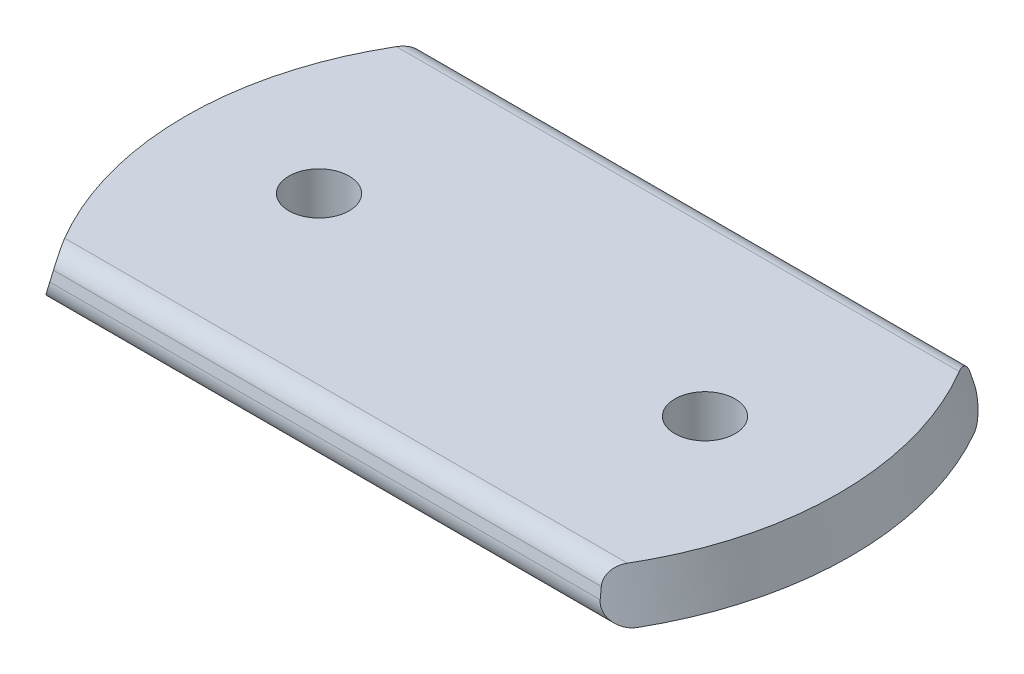
ISO-10303-21;
HEADER;
FILE_DESCRIPTION(('STEP AP214'),'2;1');
FILE_NAME('part.step','',(''),(''),'','','');
FILE_SCHEMA(('AUTOMOTIVE_DESIGN { 1 0 10303 214 1 1 1 1 }'));
ENDSEC;
DATA;
#1=APPLICATION_CONTEXT('core data for automotive mechanical design processes');
#2=APPLICATION_PROTOCOL_DEFINITION('international standard','automotive_design',2000,#1);
#3=PRODUCT_CONTEXT('',#1,'mechanical');
#4=PRODUCT('Part','Part','',(#3));
#5=PRODUCT_RELATED_PRODUCT_CATEGORY('part','',(#4));
#6=PRODUCT_DEFINITION_FORMATION('','',#4);
#7=PRODUCT_DEFINITION_CONTEXT('part definition',#1,'design');
#8=PRODUCT_DEFINITION('design','',#6,#7);
#9=PRODUCT_DEFINITION_SHAPE('','',#8);
#10=(LENGTH_UNIT() NAMED_UNIT(*) SI_UNIT(.MILLI.,.METRE.));
#11=(NAMED_UNIT(*) PLANE_ANGLE_UNIT() SI_UNIT($,.RADIAN.));
#12=(NAMED_UNIT(*) SI_UNIT($,.STERADIAN.) SOLID_ANGLE_UNIT());
#13=UNCERTAINTY_MEASURE_WITH_UNIT(LENGTH_MEASURE(1.E-05),#10,'distance_accuracy_value','');
#14=(GEOMETRIC_REPRESENTATION_CONTEXT(3) GLOBAL_UNCERTAINTY_ASSIGNED_CONTEXT((#13)) GLOBAL_UNIT_ASSIGNED_CONTEXT((#10,
#11,#12)) REPRESENTATION_CONTEXT('',''));
#15=CARTESIAN_POINT('',(0.,0.,0.));
#16=DIRECTION('',(0.,0.,1.));
#17=DIRECTION('',(1.,0.,0.));
#18=AXIS2_PLACEMENT_3D('',#15,#16,#17);
#19=CARTESIAN_POINT('',(0.,0.,0.));
#20=DIRECTION('',(0.,-1.,0.));
#21=DIRECTION('',(0.,0.,1.));
#22=AXIS2_PLACEMENT_3D('',#19,#20,#21);
#23=CONICAL_SURFACE('',#22,4.4577,0.244346095279206);
#24=CARTESIAN_POINT('',(-3.57942120669858,0.635,-2.38167671819458));
#25=CARTESIAN_POINT('',(-3.59355382997378,0.529186447528919,-2.40805899990594));
#26=CARTESIAN_POINT('',(-3.60760688365874,0.423363004117447,-2.43444374770571));
#27=CARTESIAN_POINT('',(-3.63555385157925,0.2116963374504,-2.48721817497428));
#28=CARTESIAN_POINT('',(-3.64944776581787,0.105853114195205,-2.51360785444298));
#29=CARTESIAN_POINT('',(-3.6632621104693,0.,-2.54));
#30=B_SPLINE_CURVE_WITH_KNOTS('',3,(#24,#25,#26,#27,#28,#29),.UNSPECIFIED.,.F.,.F.,(4,2,4),(0.,
0.329894224999645,0.659788443650745),.UNSPECIFIED.);
#31=CARTESIAN_POINT('',(-3.60505037779976,0.442448161481963,-2.42968528353607));
#32=VERTEX_POINT('',#31);
#33=CARTESIAN_POINT('',(-3.62185516682838,0.315448161482057,-2.46134993989713));
#34=VERTEX_POINT('',#33);
#35=EDGE_CURVE('E102',#32,#34,#30,.T.);
#36=ORIENTED_EDGE('',*,*,#35,.T.);
#37=CARTESIAN_POINT('',(-3.62185516683046,0.315448161482316,-2.46134993989706));
#38=CARTESIAN_POINT('',(-3.62353183555817,0.302651367923082,-2.46455565149963));
#39=CARTESIAN_POINT('',(-3.62596736509378,0.289732996863643,-2.46670406697731));
#40=CARTESIAN_POINT('',(-3.63212169580509,0.264120625230632,-2.46901194904047));
#41=CARTESIAN_POINT('',(-3.63583086564031,0.251425671681207,-2.4691860188125));
#42=CARTESIAN_POINT('',(-3.64431462813736,0.226569815434635,-2.46771676040685));
#43=CARTESIAN_POINT('',(-3.6490855370032,0.214407236135877,-2.46607964014288));
#44=CARTESIAN_POINT('',(-3.65948446229193,0.190774125252389,-2.4611960184554));
#45=CARTESIAN_POINT('',(-3.66511413063485,0.179304988263944,-2.45794638744581));
#46=CARTESIAN_POINT('',(-3.6777648912269,0.15585960563507,-2.44953988490581));
#47=CARTESIAN_POINT('',(-3.68487195711251,0.143997287642441,-2.44419626560958));
#48=CARTESIAN_POINT('',(-3.6996643186097,0.121499181519146,-2.43197443052928));
#49=CARTESIAN_POINT('',(-3.70734968688322,0.110863547944283,-2.42509602168947));
#50=CARTESIAN_POINT('',(-3.72471633896126,0.0888558797669503,-2.40846785233722));
#51=CARTESIAN_POINT('',(-3.73448438987867,0.077778015823586,-2.39841855750968));
#52=CARTESIAN_POINT('',(-3.75429857399305,0.0576341523944457,-2.37668588915596));
#53=CARTESIAN_POINT('',(-3.76434505746357,0.0485708296904886,-2.36500037472346));
#54=CARTESIAN_POINT('',(-3.78589696620758,0.0314605923886662,-2.33848860628803));
#55=CARTESIAN_POINT('',(-3.79740627131619,0.0237425912771575,-2.32345208762564));
#56=CARTESIAN_POINT('',(-3.8200910211819,0.0113840272561639,-2.29195751893285));
#57=CARTESIAN_POINT('',(-3.8312670693501,0.00673753329528968,-2.27550227834519));
#58=CARTESIAN_POINT('',(-3.84663573867286,0.00253654005526298,-2.25142549938294));
#59=CARTESIAN_POINT('',(-3.85112029301407,0.00159170639421385,-2.24421395374768));
#60=CARTESIAN_POINT('',(-3.85993424148771,0.000324050276130284,-2.2296522088358));
#61=CARTESIAN_POINT('',(-3.86426377245061,6.65320806708225E-07,-2.22230214103325));
#62=CARTESIAN_POINT('',(-3.86850490529811,-7.97743175265648E-13,-2.21489482542318));
#63=B_SPLINE_CURVE_WITH_KNOTS('',3,(#37,#38,#39,#40,#41,#42,#43,#44,#45,#46,#47,#48,#49,#50,#51,
#52,#53,#54,#55,#56,#57,#58,#59,#60,#61,#62),.UNSPECIFIED.,.F.,.F.,(4,2,2,2,2,2,2,2,2,2,2,2,4),
(0.,0.0397721462028032,0.0792499254443225,0.11859281134565,0.15801235495698,0.202327667248636,
0.246648556951861,0.300032821014683,0.353487599872156,0.414560178265387,0.475514478887914,
0.501127194631331,0.526716716332967),.UNSPECIFIED.);
#64=CARTESIAN_POINT('',(-3.86850490529799,0.,-2.21489482542296));
#65=VERTEX_POINT('',#64);
#66=EDGE_CURVE('E109',#34,#65,#63,.T.);
#67=ORIENTED_EDGE('',*,*,#66,.T.);
#68=CARTESIAN_POINT('',(0.,0.,0.));
#69=DIRECTION('',(0.,1.,0.));
#70=DIRECTION('',(0.,0.,1.));
#71=AXIS2_PLACEMENT_3D('',#68,#69,#70);
#72=CIRCLE('',#71,4.4577);
#73=CARTESIAN_POINT('',(-3.86850490529799,0.,2.21489482542296));
#74=VERTEX_POINT('',#73);
#75=EDGE_CURVE('E223',#65,#74,#72,.T.);
#76=ORIENTED_EDGE('',*,*,#75,.T.);
#77=CARTESIAN_POINT('',(-3.86850490529799,0.,2.21489482542296));
#78=CARTESIAN_POINT('',(-3.85769754129733,1.28477227135762E-05,2.2337771917824));
#79=CARTESIAN_POINT('',(-3.8463212568722,0.00210204438034466,2.25226551973211));
#80=CARTESIAN_POINT('',(-3.82292552324251,0.0100331100659966,2.28789645867039));
#81=CARTESIAN_POINT('',(-3.81090862680471,0.0158609759308289,2.30504382446524));
#82=CARTESIAN_POINT('',(-3.7878310893495,0.0301378327912242,2.33598501007526));
#83=CARTESIAN_POINT('',(-3.77679246180608,0.0382731334020444,2.34994279156732));
#84=CARTESIAN_POINT('',(-3.75480387416784,0.0570945568251208,2.37615510651605));
#85=CARTESIAN_POINT('',(-3.74385408130791,0.0677846811122707,2.38840691988885));
#86=CARTESIAN_POINT('',(-3.72168006276897,0.0923387298476903,2.41158146978629));
#87=CARTESIAN_POINT('',(-3.71048637865391,0.106366981444188,2.42236072082367));
#88=CARTESIAN_POINT('',(-3.68911678426731,0.13691678113401,2.44100627920766));
#89=CARTESIAN_POINT('',(-3.67893901515319,0.153433631404841,2.44887798060821));
#90=CARTESIAN_POINT('',(-3.66322334561491,0.183015530298263,2.4591051076478));
#91=CARTESIAN_POINT('',(-3.65723742920078,0.195514772884092,2.46241819315957));
#92=CARTESIAN_POINT('',(-3.64631398490201,0.22128384488999,2.46711770477328));
#93=CARTESIAN_POINT('',(-3.64137334014695,0.23455122868328,2.4685099292117));
#94=CARTESIAN_POINT('',(-3.63358467907638,0.25910702475796,2.46908330827662));
#95=CARTESIAN_POINT('',(-3.63051962766198,0.270317761821268,2.46861978942549));
#96=CARTESIAN_POINT('',(-3.62539005997241,0.292867433194884,2.46616353826032));
#97=CARTESIAN_POINT('',(-3.6233315630543,0.304206733584755,2.46416178575149));
#98=CARTESIAN_POINT('',(-3.62185516682843,0.315448161481667,2.46134993989722));
#99=B_SPLINE_CURVE_WITH_KNOTS('',3,(#77,#78,#79,#80,#81,#82,#83,#84,#85,#86,#87,#88,#89,#90,#91,
#92,#93,#94,#95,#96,#97,#98),.UNSPECIFIED.,.F.,.F.,(4,2,2,2,2,2,2,2,2,2,4),(0.,
0.0650808976333647,0.129919447165532,0.188389191585578,0.246951121031619,0.309425631457381,
0.371783650699652,0.414371820555602,0.456831149837567,0.491587088924296,0.526548406712284),.UNSPECIFIED.);
#100=CARTESIAN_POINT('',(-3.62185516682838,0.315448161482057,2.46134993989713));
#101=VERTEX_POINT('',#100);
#102=EDGE_CURVE('E110',#74,#101,#99,.T.);
#103=ORIENTED_EDGE('',*,*,#102,.T.);
#104=CARTESIAN_POINT('',(-3.57942120669858,0.635,2.38167671819458));
#105=CARTESIAN_POINT('',(-3.59355382997378,0.529186447528919,2.40805899990594));
#106=CARTESIAN_POINT('',(-3.60760688365874,0.423363004117447,2.43444374770571));
#107=CARTESIAN_POINT('',(-3.63555385157925,0.2116963374504,2.48721817497428));
#108=CARTESIAN_POINT('',(-3.64944776581787,0.105853114195205,2.51360785444298));
#109=CARTESIAN_POINT('',(-3.6632621104693,0.,2.54));
#110=B_SPLINE_CURVE_WITH_KNOTS('',3,(#104,#105,#106,#107,#108,#109),.UNSPECIFIED.,.F.,.F.,(4,2,
4),(0.,0.329894224999645,0.659788443650745),.UNSPECIFIED.);
#111=CARTESIAN_POINT('',(-3.60505037779977,0.442448161481929,2.42968528353607));
#112=VERTEX_POINT('',#111);
#113=EDGE_CURVE('E126',#112,#101,#110,.T.);
#114=ORIENTED_EDGE('',*,*,#113,.F.);
#115=CARTESIAN_POINT('',(-3.60505037780288,0.442448161482316,2.42968528353598));
#116=CARTESIAN_POINT('',(-3.60351683648761,0.453903731813594,2.42684791105927));
#117=CARTESIAN_POINT('',(-3.60259930080507,0.465224667819872,2.42315969733341));
#118=CARTESIAN_POINT('',(-3.60197543178231,0.487229429827425,2.41424783379584));
#119=CARTESIAN_POINT('',(-3.60226435348951,0.497915584409928,2.40903027404083));
#120=CARTESIAN_POINT('',(-3.60402112924876,0.518380677834707,2.39719978949328));
#121=CARTESIAN_POINT('',(-3.6054892869793,0.528159382265468,2.39058650559539));
#122=CARTESIAN_POINT('',(-3.60949137315661,0.546577151586215,2.37619852638241));
#123=CARTESIAN_POINT('',(-3.61202586159684,0.555215614531771,2.36842322220699));
#124=CARTESIAN_POINT('',(-3.61809855392584,0.571433056633792,2.35172548288871));
#125=CARTESIAN_POINT('',(-3.62166350470801,0.578974462627466,2.34277650675638));
#126=CARTESIAN_POINT('',(-3.62959078672059,0.592624696894625,2.32417098366835));
#127=CARTESIAN_POINT('',(-3.63395349668359,0.598732841575587,2.3145141019478));
#128=CARTESIAN_POINT('',(-3.64399610679775,0.610287900439548,2.29327408517538));
#129=CARTESIAN_POINT('',(-3.64977530427532,0.615508993497572,2.28161522812382));
#130=CARTESIAN_POINT('',(-3.66195161447901,0.624088831060702,2.25794715600665));
#131=CARTESIAN_POINT('',(-3.66834906918393,0.627446537861267,2.24593774963334));
#132=CARTESIAN_POINT('',(-3.68421437006381,0.633328208008464,2.21701722438262));
#133=CARTESIAN_POINT('',(-3.69389683874262,0.634998922643189,2.2000437412127));
#134=CARTESIAN_POINT('',(-3.70380158672838,0.635000000000007,2.18323016906187));
#135=B_SPLINE_CURVE_WITH_KNOTS('',3,(#115,#116,#117,#118,#119,#120,#121,#122,#123,#124,#125,
#126,#127,#128,#129,#130,#131,#132,#133,#134),.UNSPECIFIED.,.F.,.F.,(4,2,2,2,2,2,2,2,2,4),(0.,
0.0356496979092752,0.0711593191952307,0.106678087900932,0.14221553294611,0.178774057747515,
0.215349983818304,0.257252222234309,0.299177772307115,0.357664321652882),.UNSPECIFIED.);
#136=CARTESIAN_POINT('',(-3.70380158672838,0.635,2.18323016906187));
#137=VERTEX_POINT('',#136);
#138=EDGE_CURVE('E128',#112,#137,#135,.T.);
#139=ORIENTED_EDGE('',*,*,#138,.T.);
#140=CARTESIAN_POINT('',(0.,0.635,0.));
#141=DIRECTION('',(0.,1.,0.));
#142=DIRECTION('',(0.,0.,1.));
#143=AXIS2_PLACEMENT_3D('',#140,#141,#142);
#144=CIRCLE('',#143,4.29937671819458);
#145=CARTESIAN_POINT('',(-3.70380158672838,0.635,-2.18323016906187));
#146=VERTEX_POINT('',#145);
#147=EDGE_CURVE('E104',#146,#137,#144,.T.);
#148=ORIENTED_EDGE('',*,*,#147,.F.);
#149=CARTESIAN_POINT('',(-3.70380158672838,0.635,-2.18323016906187));
#150=CARTESIAN_POINT('',(-3.69501254105115,0.635003156654622,-2.1981481730324));
#151=CARTESIAN_POINT('',(-3.68638838666827,0.633684342955495,-2.21321156760848));
#152=CARTESIAN_POINT('',(-3.66974011331162,0.628271785468378,-2.24329252460308));
#153=CARTESIAN_POINT('',(-3.6617201556718,0.624160460985696,-2.25830918746991));
#154=CARTESIAN_POINT('',(-3.6478445121476,0.613897197544928,-2.28546205520625));
#155=CARTESIAN_POINT('',(-3.6418463794629,0.608163705677054,-2.29768213449366));
#156=CARTESIAN_POINT('',(-3.63082103433196,0.594599089578594,-2.32134930340013));
#157=CARTESIAN_POINT('',(-3.62579173880106,0.586772554165542,-2.33279801624068));
#158=CARTESIAN_POINT('',(-3.61694115982392,0.568973879345322,-2.35464169625366));
#159=CARTESIAN_POINT('',(-3.61313153364109,0.558982481536817,-2.3650258852967));
#160=CARTESIAN_POINT('',(-3.60709863833828,0.537100081085371,-2.38412602870431));
#161=CARTESIAN_POINT('',(-3.6048736818196,0.525211115591873,-2.39284375030696));
#162=CARTESIAN_POINT('',(-3.60244018219319,0.501756542546049,-2.40704569837035));
#163=CARTESIAN_POINT('',(-3.60198904775445,0.490387238416409,-2.41281390748986));
#164=CARTESIAN_POINT('',(-3.60246617381185,0.466884133166213,-2.42261671418551));
#165=CARTESIAN_POINT('',(-3.60340153323925,0.454746704343675,-2.42664225259117));
#166=CARTESIAN_POINT('',(-3.60505037779968,0.442448161482579,-2.42968528353591));
#167=B_SPLINE_CURVE_WITH_KNOTS('',3,(#149,#150,#151,#152,#153,#154,#155,#156,#157,#158,#159,
#160,#161,#162,#163,#164,#165,#166),.UNSPECIFIED.,.F.,.F.,(4,2,2,2,2,2,2,2,4),(0.,
0.051960016866817,0.104250225994487,0.14838224931397,0.192418299119125,0.236863470297449,
0.281261244022129,0.319318422377635,0.357571130007116),.UNSPECIFIED.);
#168=EDGE_CURVE('E100',#146,#32,#167,.T.);
#169=ORIENTED_EDGE('',*,*,#168,.T.);
#170=EDGE_LOOP('',(#36,#67,#76,#103,#114,#139,#148,#169));
#171=FACE_BOUND('',#170,.T.);
#172=ADVANCED_FACE('F33',(#171),#23,.T.);
#173=CARTESIAN_POINT('',(-3.6632621104693,0.,2.54));
#174=DIRECTION('',(0.,0.241921895599668,0.970295726275996));
#175=DIRECTION('',(0.,-0.970295726275996,0.241921895599668));
#176=AXIS2_PLACEMENT_3D('',#173,#174,#175);
#177=PLANE('',#176);
#178=ORIENTED_EDGE('',*,*,#113,.T.);
#179=DIRECTION('',(1.,0.,0.));
#180=VECTOR('',#179,1.);
#181=CARTESIAN_POINT('',(-3.6632621104693,0.315448161482316,2.46134993989706));
#182=LINE('',#181,#180);
#183=CARTESIAN_POINT('',(3.62185516682838,0.315448161482057,2.46134993989713));
#184=VERTEX_POINT('',#183);
#185=EDGE_CURVE('E11',#101,#184,#182,.T.);
#186=ORIENTED_EDGE('',*,*,#185,.T.);
#187=CARTESIAN_POINT('',(3.57942120669858,0.635,2.38167671819458));
#188=CARTESIAN_POINT('',(3.59355382997378,0.529186447528919,2.40805899990594));
#189=CARTESIAN_POINT('',(3.60760688365874,0.423363004117447,2.43444374770571));
#190=CARTESIAN_POINT('',(3.63555385157925,0.2116963374504,2.48721817497428));
#191=CARTESIAN_POINT('',(3.64944776581787,0.105853114195205,2.51360785444298));
#192=CARTESIAN_POINT('',(3.6632621104693,0.,2.54));
#193=B_SPLINE_CURVE_WITH_KNOTS('',3,(#187,#188,#189,#190,#191,#192),.UNSPECIFIED.,.F.,.F.,(4,2,
4),(0.,0.329894224999645,0.659788443650745),.UNSPECIFIED.);
#194=CARTESIAN_POINT('',(3.60505037779976,0.442448161481965,2.42968528353607));
#195=VERTEX_POINT('',#194);
#196=EDGE_CURVE('E131',#195,#184,#193,.T.);
#197=ORIENTED_EDGE('',*,*,#196,.F.);
#198=DIRECTION('',(1.,0.,0.));
#199=VECTOR('',#198,1.);
#200=CARTESIAN_POINT('',(-3.57942120669858,0.442448161482316,2.42968528353598));
#201=LINE('',#200,#199);
#202=EDGE_CURVE('E42',#195,#112,#201,.F.);
#203=ORIENTED_EDGE('',*,*,#202,.T.);
#204=EDGE_LOOP('',(#178,#186,#197,#203));
#205=FACE_BOUND('',#204,.T.);
#206=ADVANCED_FACE('F148',(#205),#177,.T.);
#207=CARTESIAN_POINT('',(0.,0.,0.));
#208=DIRECTION('',(0.,-1.,0.));
#209=DIRECTION('',(0.,0.,1.));
#210=AXIS2_PLACEMENT_3D('',#207,#208,#209);
#211=CONICAL_SURFACE('',#210,4.4577,0.244346095279206);
#212=CARTESIAN_POINT('',(0.,0.,0.));
#213=DIRECTION('',(0.,1.,0.));
#214=DIRECTION('',(0.,0.,1.));
#215=AXIS2_PLACEMENT_3D('',#212,#213,#214);
#216=CIRCLE('',#215,4.4577);
#217=CARTESIAN_POINT('',(3.86850490529799,0.,2.21489482542296));
#218=VERTEX_POINT('',#217);
#219=CARTESIAN_POINT('',(3.86850490529799,0.,-2.21489482542296));
#220=VERTEX_POINT('',#219);
#221=EDGE_CURVE('E229',#218,#220,#216,.T.);
#222=ORIENTED_EDGE('',*,*,#221,.T.);
#223=CARTESIAN_POINT('',(3.86850490529799,0.,-2.21489482542296));
#224=CARTESIAN_POINT('',(3.85769754129733,1.28477227136003E-05,-2.2337771917824));
#225=CARTESIAN_POINT('',(3.8463212568722,0.00210204438034468,-2.25226551973211));
#226=CARTESIAN_POINT('',(3.82292552324251,0.0100331100659966,-2.28789645867039));
#227=CARTESIAN_POINT('',(3.81090862680471,0.0158609759308289,-2.30504382446524));
#228=CARTESIAN_POINT('',(3.7878310893495,0.0301378327912243,-2.33598501007526));
#229=CARTESIAN_POINT('',(3.77679246180608,0.0382731334020446,-2.34994279156732));
#230=CARTESIAN_POINT('',(3.75480387416784,0.0570945568251212,-2.37615510651605));
#231=CARTESIAN_POINT('',(3.74385408130791,0.0677846811122711,-2.38840691988885));
#232=CARTESIAN_POINT('',(3.72168006276897,0.0923387298476907,-2.4115814697863));
#233=CARTESIAN_POINT('',(3.71048637865391,0.106366981444188,-2.42236072082367));
#234=CARTESIAN_POINT('',(3.68911678426731,0.13691678113401,-2.44100627920766));
#235=CARTESIAN_POINT('',(3.67893901515319,0.15343363140484,-2.44887798060821));
#236=CARTESIAN_POINT('',(3.66322334561491,0.183015530298263,-2.4591051076478));
#237=CARTESIAN_POINT('',(3.65723742920078,0.195514772884092,-2.46241819315958));
#238=CARTESIAN_POINT('',(3.64631398490201,0.221283844889989,-2.46711770477328));
#239=CARTESIAN_POINT('',(3.64137334014695,0.23455122868328,-2.4685099292117));
#240=CARTESIAN_POINT('',(3.63358467907638,0.259107024757959,-2.46908330827662));
#241=CARTESIAN_POINT('',(3.63051962766198,0.270317761821268,-2.46861978942549));
#242=CARTESIAN_POINT('',(3.62539005997241,0.292867433194884,-2.46616353826032));
#243=CARTESIAN_POINT('',(3.6233315630543,0.304206733584755,-2.46416178575149));
#244=CARTESIAN_POINT('',(3.62185516682843,0.315448161481667,-2.46134993989722));
#245=B_SPLINE_CURVE_WITH_KNOTS('',3,(#223,#224,#225,#226,#227,#228,#229,#230,#231,#232,#233,
#234,#235,#236,#237,#238,#239,#240,#241,#242,#243,#244),.UNSPECIFIED.,.F.,.F.,(4,2,2,2,2,2,2,2,
2,2,4),(0.,0.0650808976333645,0.129919447165532,0.188389191585579,0.246951121031619,
0.30942563145738,0.371783650699652,0.414371820555602,0.456831149837567,0.491587088924296,
0.526548406712283),.UNSPECIFIED.);
#246=CARTESIAN_POINT('',(3.62185516682838,0.315448161482057,-2.46134993989713));
#247=VERTEX_POINT('',#246);
#248=EDGE_CURVE('E189',#220,#247,#245,.T.);
#249=ORIENTED_EDGE('',*,*,#248,.T.);
#250=CARTESIAN_POINT('',(3.57942120669858,0.635,-2.38167671819458));
#251=CARTESIAN_POINT('',(3.59355382997378,0.529186447528919,-2.40805899990594));
#252=CARTESIAN_POINT('',(3.60760688365874,0.423363004117447,-2.43444374770571));
#253=CARTESIAN_POINT('',(3.63555385157925,0.2116963374504,-2.48721817497428));
#254=CARTESIAN_POINT('',(3.64944776581787,0.105853114195205,-2.51360785444298));
#255=CARTESIAN_POINT('',(3.6632621104693,0.,-2.54));
#256=B_SPLINE_CURVE_WITH_KNOTS('',3,(#250,#251,#252,#253,#254,#255),.UNSPECIFIED.,.F.,.F.,(4,2,
4),(0.,0.329894224999645,0.659788443650745),.UNSPECIFIED.);
#257=CARTESIAN_POINT('',(3.60505037779977,0.442448161481929,-2.42968528353607));
#258=VERTEX_POINT('',#257);
#259=EDGE_CURVE('E120',#258,#247,#256,.T.);
#260=ORIENTED_EDGE('',*,*,#259,.F.);
#261=CARTESIAN_POINT('',(3.60505037780288,0.442448161482316,-2.42968528353598));
#262=CARTESIAN_POINT('',(3.60351683648761,0.453903731813594,-2.42684791105927));
#263=CARTESIAN_POINT('',(3.60259930080507,0.465224667819872,-2.42315969733341));
#264=CARTESIAN_POINT('',(3.60197543178231,0.487229429827425,-2.41424783379584));
#265=CARTESIAN_POINT('',(3.60226435348951,0.497915584409928,-2.40903027404083));
#266=CARTESIAN_POINT('',(3.60402112924876,0.518380677834708,-2.39719978949329));
#267=CARTESIAN_POINT('',(3.6054892869793,0.528159382265468,-2.3905865055954));
#268=CARTESIAN_POINT('',(3.60949137315661,0.546577151586215,-2.37619852638241));
#269=CARTESIAN_POINT('',(3.61202586159684,0.555215614531771,-2.36842322220699));
#270=CARTESIAN_POINT('',(3.61809855392584,0.571433056633792,-2.35172548288871));
#271=CARTESIAN_POINT('',(3.62166350470801,0.578974462627466,-2.34277650675638));
#272=CARTESIAN_POINT('',(3.62959078672059,0.592624696894625,-2.32417098366835));
#273=CARTESIAN_POINT('',(3.63395349668359,0.598732841575587,-2.3145141019478));
#274=CARTESIAN_POINT('',(3.64399610679775,0.610287900439548,-2.29327408517538));
#275=CARTESIAN_POINT('',(3.64977530427532,0.615508993497572,-2.28161522812382));
#276=CARTESIAN_POINT('',(3.66195161447901,0.624088831060702,-2.25794715600665));
#277=CARTESIAN_POINT('',(3.66834906918393,0.627446537861267,-2.24593774963334));
#278=CARTESIAN_POINT('',(3.68421437006381,0.633328208008464,-2.21701722438263));
#279=CARTESIAN_POINT('',(3.69389683874262,0.63499892264319,-2.20004374121271));
#280=CARTESIAN_POINT('',(3.70380158672838,0.635000000000007,-2.18323016906188));
#281=B_SPLINE_CURVE_WITH_KNOTS('',3,(#261,#262,#263,#264,#265,#266,#267,#268,#269,#270,#271,
#272,#273,#274,#275,#276,#277,#278,#279,#280),.UNSPECIFIED.,.F.,.F.,(4,2,2,2,2,2,2,2,2,4),(0.,
0.0356496979092751,0.0711593191952307,0.106678087900932,0.14221553294611,0.178774057747515,
0.215349983818303,0.257252222234309,0.299177772307115,0.357664321652881),.UNSPECIFIED.);
#282=CARTESIAN_POINT('',(3.70380158672838,0.635,-2.18323016906188));
#283=VERTEX_POINT('',#282);
#284=EDGE_CURVE('E125',#258,#283,#281,.T.);
#285=ORIENTED_EDGE('',*,*,#284,.T.);
#286=CARTESIAN_POINT('',(0.,0.635,0.));
#287=DIRECTION('',(0.,1.,0.));
#288=DIRECTION('',(0.,0.,1.));
#289=AXIS2_PLACEMENT_3D('',#286,#287,#288);
#290=CIRCLE('',#289,4.29937671819458);
#291=CARTESIAN_POINT('',(3.70380158672838,0.635,2.18323016906188));
#292=VERTEX_POINT('',#291);
#293=EDGE_CURVE('E121',#292,#283,#290,.T.);
#294=ORIENTED_EDGE('',*,*,#293,.F.);
#295=CARTESIAN_POINT('',(3.70380158672838,0.635,2.18323016906188));
#296=CARTESIAN_POINT('',(3.69501254105115,0.635003156654622,2.1981481730324));
#297=CARTESIAN_POINT('',(3.68638838666827,0.633684342955495,2.21321156760849));
#298=CARTESIAN_POINT('',(3.66974011331162,0.628271785468378,2.24329252460308));
#299=CARTESIAN_POINT('',(3.6617201556718,0.624160460985696,2.25830918746991));
#300=CARTESIAN_POINT('',(3.6478445121476,0.613897197544928,2.28546205520625));
#301=CARTESIAN_POINT('',(3.6418463794629,0.608163705677054,2.29768213449366));
#302=CARTESIAN_POINT('',(3.63082103433196,0.594599089578594,2.32134930340013));
#303=CARTESIAN_POINT('',(3.62579173880106,0.586772554165541,2.33279801624068));
#304=CARTESIAN_POINT('',(3.61694115982392,0.568973879345322,2.35464169625366));
#305=CARTESIAN_POINT('',(3.61313153364109,0.558982481536816,2.3650258852967));
#306=CARTESIAN_POINT('',(3.60709863833828,0.53710008108537,2.38412602870432));
#307=CARTESIAN_POINT('',(3.6048736818196,0.525211115591873,2.39284375030697));
#308=CARTESIAN_POINT('',(3.60244018219319,0.501756542546048,2.40704569837036));
#309=CARTESIAN_POINT('',(3.60198904775445,0.490387238416408,2.41281390748986));
#310=CARTESIAN_POINT('',(3.60246617381185,0.466884133166211,2.42261671418551));
#311=CARTESIAN_POINT('',(3.60340153323925,0.454746704343673,2.42664225259117));
#312=CARTESIAN_POINT('',(3.60505037779968,0.442448161482577,2.42968528353591));
#313=B_SPLINE_CURVE_WITH_KNOTS('',3,(#295,#296,#297,#298,#299,#300,#301,#302,#303,#304,#305,
#306,#307,#308,#309,#310,#311,#312),.UNSPECIFIED.,.F.,.F.,(4,2,2,2,2,2,2,2,4),(0.,
0.051960016866817,0.104250225994487,0.14838224931397,0.192418299119126,0.23686347029745,
0.28126124402213,0.319318422377636,0.357571130007118),.UNSPECIFIED.);
#314=EDGE_CURVE('E56',#292,#195,#313,.T.);
#315=ORIENTED_EDGE('',*,*,#314,.T.);
#316=ORIENTED_EDGE('',*,*,#196,.T.);
#317=CARTESIAN_POINT('',(3.62185516683046,0.315448161482316,2.46134993989706));
#318=CARTESIAN_POINT('',(3.62353183555817,0.302651367923082,2.46455565149963));
#319=CARTESIAN_POINT('',(3.62596736509378,0.289732996863642,2.46670406697731));
#320=CARTESIAN_POINT('',(3.63212169580509,0.264120625230632,2.46901194904047));
#321=CARTESIAN_POINT('',(3.63583086564031,0.251425671681207,2.4691860188125));
#322=CARTESIAN_POINT('',(3.64431462813736,0.226569815434635,2.46771676040685));
#323=CARTESIAN_POINT('',(3.6490855370032,0.214407236135877,2.46607964014288));
#324=CARTESIAN_POINT('',(3.65948446229193,0.190774125252389,2.4611960184554));
#325=CARTESIAN_POINT('',(3.66511413063485,0.179304988263944,2.45794638744581));
#326=CARTESIAN_POINT('',(3.67776489122691,0.15585960563507,2.44953988490581));
#327=CARTESIAN_POINT('',(3.68487195711251,0.143997287642441,2.44419626560958));
#328=CARTESIAN_POINT('',(3.6996643186097,0.121499181519146,2.43197443052928));
#329=CARTESIAN_POINT('',(3.70734968688322,0.110863547944283,2.42509602168948));
#330=CARTESIAN_POINT('',(3.72471633896126,0.0888558797669501,2.40846785233723));
#331=CARTESIAN_POINT('',(3.73448438987867,0.0777780158235859,2.39841855750968));
#332=CARTESIAN_POINT('',(3.75429857399305,0.0576341523944456,2.37668588915596));
#333=CARTESIAN_POINT('',(3.76434505746357,0.0485708296904886,2.36500037472346));
#334=CARTESIAN_POINT('',(3.78589696620758,0.0314605923886662,2.33848860628803));
#335=CARTESIAN_POINT('',(3.79740627131619,0.0237425912771575,2.32345208762564));
#336=CARTESIAN_POINT('',(3.8200910211819,0.0113840272561639,2.29195751893285));
#337=CARTESIAN_POINT('',(3.8312670693501,0.00673753329528968,2.27550227834519));
#338=CARTESIAN_POINT('',(3.84663573867286,0.00253654005526301,2.25142549938294));
#339=CARTESIAN_POINT('',(3.85112029301407,0.0015917063942139,2.24421395374768));
#340=CARTESIAN_POINT('',(3.85993424148771,0.000324050276130334,2.2296522088358));
#341=CARTESIAN_POINT('',(3.86426377245061,6.65320806748798E-07,2.22230214103326));
#342=CARTESIAN_POINT('',(3.86850490529811,-7.97735551141942E-13,2.21489482542318));
#343=B_SPLINE_CURVE_WITH_KNOTS('',3,(#317,#318,#319,#320,#321,#322,#323,#324,#325,#326,#327,
#328,#329,#330,#331,#332,#333,#334,#335,#336,#337,#338,#339,#340,#341,#342),.UNSPECIFIED.,.F.,
.F.,(4,2,2,2,2,2,2,2,2,2,2,2,4),(0.,0.0397721462028034,0.0792499254443227,0.118592811345651,
0.158012354956981,0.202327667248636,0.246648556951861,0.300032821014683,0.353487599872156,
0.414560178265388,0.475514478887914,0.50112719463133,0.526716716332967),.UNSPECIFIED.);
#344=EDGE_CURVE('E49',#184,#218,#343,.T.);
#345=ORIENTED_EDGE('',*,*,#344,.T.);
#346=EDGE_LOOP('',(#222,#249,#260,#285,#294,#315,#316,#345));
#347=FACE_BOUND('',#346,.T.);
#348=ADVANCED_FACE('F198',(#347),#211,.T.);
#349=CARTESIAN_POINT('',(-3.6632621104693,0.,-2.54));
#350=DIRECTION('',(0.,0.241921895599668,-0.970295726275996));
#351=DIRECTION('',(0.,0.970295726275996,0.241921895599668));
#352=AXIS2_PLACEMENT_3D('',#349,#350,#351);
#353=PLANE('',#352);
#354=ORIENTED_EDGE('',*,*,#259,.T.);
#355=DIRECTION('',(-1.,0.,0.));
#356=VECTOR('',#355,1.);
#357=CARTESIAN_POINT('',(-3.6632621104693,0.315448161482316,-2.46134993989706));
#358=LINE('',#357,#356);
#359=EDGE_CURVE('E119',#247,#34,#358,.T.);
#360=ORIENTED_EDGE('',*,*,#359,.T.);
#361=ORIENTED_EDGE('',*,*,#35,.F.);
#362=DIRECTION('',(-1.,0.,0.));
#363=VECTOR('',#362,1.);
#364=CARTESIAN_POINT('',(3.57942120669858,0.442448161482316,-2.42968528353598));
#365=LINE('',#364,#363);
#366=EDGE_CURVE('E116',#32,#258,#365,.F.);
#367=ORIENTED_EDGE('',*,*,#366,.T.);
#368=EDGE_LOOP('',(#354,#360,#361,#367));
#369=FACE_BOUND('',#368,.T.);
#370=ADVANCED_FACE('F115',(#369),#353,.T.);
#371=CARTESIAN_POINT('',(0.,0.635,0.));
#372=DIRECTION('',(0.,1.,0.));
#373=DIRECTION('',(0.,0.,1.));
#374=AXIS2_PLACEMENT_3D('',#371,#372,#373);
#375=PLANE('',#374);
#376=CARTESIAN_POINT('',(-2.54,0.635,0.));
#377=DIRECTION('',(0.,1.,0.));
#378=DIRECTION('',(0.,0.,1.));
#379=AXIS2_PLACEMENT_3D('',#376,#377,#378);
#380=CIRCLE('',#379,0.396874999999997);
#381=CARTESIAN_POINT('',(-2.54,0.635,0.396874999999998));
#382=VERTEX_POINT('',#381);
#383=EDGE_CURVE('E258',#382,#382,#380,.T.);
#384=ORIENTED_EDGE('',*,*,#383,.F.);
#385=EDGE_LOOP('',(#384));
#386=FACE_BOUND('',#385,.T.);
#387=CARTESIAN_POINT('',(2.54,0.635,0.));
#388=DIRECTION('',(0.,1.,0.));
#389=DIRECTION('',(0.,0.,1.));
#390=AXIS2_PLACEMENT_3D('',#387,#388,#389);
#391=CIRCLE('',#390,0.396874999999997);
#392=CARTESIAN_POINT('',(2.54,0.635,0.396874999999997));
#393=VERTEX_POINT('',#392);
#394=EDGE_CURVE('E230',#393,#393,#391,.T.);
#395=ORIENTED_EDGE('',*,*,#394,.F.);
#396=EDGE_LOOP('',(#395));
#397=FACE_BOUND('',#396,.T.);
#398=ORIENTED_EDGE('',*,*,#293,.T.);
#399=DIRECTION('',(1.,0.,0.));
#400=VECTOR('',#399,1.);
#401=CARTESIAN_POINT('',(-3.57942120669858,0.635,-2.18323016906187));
#402=LINE('',#401,#400);
#403=EDGE_CURVE('E235',#283,#146,#402,.F.);
#404=ORIENTED_EDGE('',*,*,#403,.T.);
#405=ORIENTED_EDGE('',*,*,#147,.T.);
#406=DIRECTION('',(-1.,0.,0.));
#407=VECTOR('',#406,1.);
#408=CARTESIAN_POINT('',(3.57942120669858,0.635,2.18323016906188));
#409=LINE('',#408,#407);
#410=EDGE_CURVE('E233',#137,#292,#409,.F.);
#411=ORIENTED_EDGE('',*,*,#410,.T.);
#412=EDGE_LOOP('',(#398,#404,#405,#411));
#413=FACE_BOUND('',#412,.T.);
#414=ADVANCED_FACE('F251',(#386,#397,#413),#375,.T.);
#415=CARTESIAN_POINT('',(0.,0.,0.));
#416=DIRECTION('',(0.,1.,0.));
#417=DIRECTION('',(0.,0.,1.));
#418=AXIS2_PLACEMENT_3D('',#415,#416,#417);
#419=PLANE('',#418);
#420=CARTESIAN_POINT('',(-2.54,0.,0.));
#421=DIRECTION('',(0.,-1.,0.));
#422=DIRECTION('',(0.,0.,-1.));
#423=AXIS2_PLACEMENT_3D('',#420,#421,#422);
#424=CIRCLE('',#423,0.396874999999998);
#425=CARTESIAN_POINT('',(-2.54,0.,-0.396874999999998));
#426=VERTEX_POINT('',#425);
#427=EDGE_CURVE('E261',#426,#426,#424,.T.);
#428=ORIENTED_EDGE('',*,*,#427,.F.);
#429=EDGE_LOOP('',(#428));
#430=FACE_BOUND('',#429,.T.);
#431=CARTESIAN_POINT('',(2.54,0.,0.));
#432=DIRECTION('',(0.,-1.,0.));
#433=DIRECTION('',(0.,0.,-1.));
#434=AXIS2_PLACEMENT_3D('',#431,#432,#433);
#435=CIRCLE('',#434,0.396874999999998);
#436=CARTESIAN_POINT('',(2.54,0.,-0.396874999999998));
#437=VERTEX_POINT('',#436);
#438=EDGE_CURVE('E255',#437,#437,#435,.T.);
#439=ORIENTED_EDGE('',*,*,#438,.F.);
#440=EDGE_LOOP('',(#439));
#441=FACE_BOUND('',#440,.T.);
#442=ORIENTED_EDGE('',*,*,#75,.F.);
#443=DIRECTION('',(1.,0.,0.));
#444=VECTOR('',#443,1.);
#445=CARTESIAN_POINT('',(0.,0.,-2.21489482542296));
#446=LINE('',#445,#444);
#447=EDGE_CURVE('E217',#65,#220,#446,.T.);
#448=ORIENTED_EDGE('',*,*,#447,.T.);
#449=ORIENTED_EDGE('',*,*,#221,.F.);
#450=DIRECTION('',(-1.,0.,0.));
#451=VECTOR('',#450,1.);
#452=CARTESIAN_POINT('',(0.,0.,2.21489482542296));
#453=LINE('',#452,#451);
#454=EDGE_CURVE('E218',#218,#74,#453,.T.);
#455=ORIENTED_EDGE('',*,*,#454,.T.);
#456=EDGE_LOOP('',(#442,#448,#449,#455));
#457=FACE_BOUND('',#456,.T.);
#458=ADVANCED_FACE('F227',(#430,#441,#457),#419,.F.);
#459=CARTESIAN_POINT('',(2.54,0.,0.));
#460=DIRECTION('',(0.,-1.,0.));
#461=DIRECTION('',(0.,0.,-1.));
#462=AXIS2_PLACEMENT_3D('',#459,#460,#461);
#463=CYLINDRICAL_SURFACE('',#462,0.396874999999997);
#464=ORIENTED_EDGE('',*,*,#394,.T.);
#465=EDGE_LOOP('',(#464));
#466=FACE_BOUND('',#465,.T.);
#467=ORIENTED_EDGE('',*,*,#438,.T.);
#468=EDGE_LOOP('',(#467));
#469=FACE_BOUND('',#468,.T.);
#470=ADVANCED_FACE('F269',(#466,#469),#463,.F.);
#471=CARTESIAN_POINT('',(-2.54,0.,0.));
#472=DIRECTION('',(0.,-1.,0.));
#473=DIRECTION('',(0.,0.,-1.));
#474=AXIS2_PLACEMENT_3D('',#471,#472,#473);
#475=CYLINDRICAL_SURFACE('',#474,0.396874999999997);
#476=ORIENTED_EDGE('',*,*,#383,.T.);
#477=EDGE_LOOP('',(#476));
#478=FACE_BOUND('',#477,.T.);
#479=ORIENTED_EDGE('',*,*,#427,.T.);
#480=EDGE_LOOP('',(#479));
#481=FACE_BOUND('',#480,.T.);
#482=ADVANCED_FACE('F265',(#478,#481),#475,.F.);
#483=CARTESIAN_POINT('',(-3.6632621104693,0.254,-2.21489482542296));
#484=DIRECTION('',(1.,0.,0.));
#485=DIRECTION('',(0.,0.,-1.));
#486=AXIS2_PLACEMENT_3D('',#483,#484,#485);
#487=CYLINDRICAL_SURFACE('',#486,0.254);
#488=ORIENTED_EDGE('',*,*,#248,.F.);
#489=ORIENTED_EDGE('',*,*,#447,.F.);
#490=ORIENTED_EDGE('',*,*,#66,.F.);
#491=ORIENTED_EDGE('',*,*,#359,.F.);
#492=EDGE_LOOP('',(#488,#489,#490,#491));
#493=FACE_BOUND('',#492,.T.);
#494=ADVANCED_FACE('F179',(#493),#487,.T.);
#495=CARTESIAN_POINT('',(0.,0.381,-2.18323016906187));
#496=DIRECTION('',(-1.,0.,0.));
#497=DIRECTION('',(0.,0.,1.));
#498=AXIS2_PLACEMENT_3D('',#495,#496,#497);
#499=CYLINDRICAL_SURFACE('',#498,0.254);
#500=ORIENTED_EDGE('',*,*,#284,.F.);
#501=ORIENTED_EDGE('',*,*,#366,.F.);
#502=ORIENTED_EDGE('',*,*,#168,.F.);
#503=ORIENTED_EDGE('',*,*,#403,.F.);
#504=EDGE_LOOP('',(#500,#501,#502,#503));
#505=FACE_BOUND('',#504,.T.);
#506=ADVANCED_FACE('F124',(#505),#499,.T.);
#507=CARTESIAN_POINT('',(-3.6632621104693,0.254,2.21489482542296));
#508=DIRECTION('',(-1.,0.,0.));
#509=DIRECTION('',(0.,0.,1.));
#510=AXIS2_PLACEMENT_3D('',#507,#508,#509);
#511=CYLINDRICAL_SURFACE('',#510,0.254);
#512=ORIENTED_EDGE('',*,*,#102,.F.);
#513=ORIENTED_EDGE('',*,*,#454,.F.);
#514=ORIENTED_EDGE('',*,*,#344,.F.);
#515=ORIENTED_EDGE('',*,*,#185,.F.);
#516=EDGE_LOOP('',(#512,#513,#514,#515));
#517=FACE_BOUND('',#516,.T.);
#518=ADVANCED_FACE('F178',(#517),#511,.T.);
#519=CARTESIAN_POINT('',(0.,0.381,2.18323016906187));
#520=DIRECTION('',(1.,0.,0.));
#521=DIRECTION('',(0.,0.,-1.));
#522=AXIS2_PLACEMENT_3D('',#519,#520,#521);
#523=CYLINDRICAL_SURFACE('',#522,0.254);
#524=ORIENTED_EDGE('',*,*,#138,.F.);
#525=ORIENTED_EDGE('',*,*,#202,.F.);
#526=ORIENTED_EDGE('',*,*,#314,.F.);
#527=ORIENTED_EDGE('',*,*,#410,.F.);
#528=EDGE_LOOP('',(#524,#525,#526,#527));
#529=FACE_BOUND('',#528,.T.);
#530=ADVANCED_FACE('F35',(#529),#523,.T.);
#531=CLOSED_SHELL('',(#172,#206,#348,#370,#414,#458,#470,#482,#494,#506,#518,#530));
#532=MANIFOLD_SOLID_BREP('B2',#531);
#533=ADVANCED_BREP_SHAPE_REPRESENTATION('',(#18,#532),#14);
#534=SHAPE_DEFINITION_REPRESENTATION(#9,#533);
ENDSEC;
END-ISO-10303-21;
